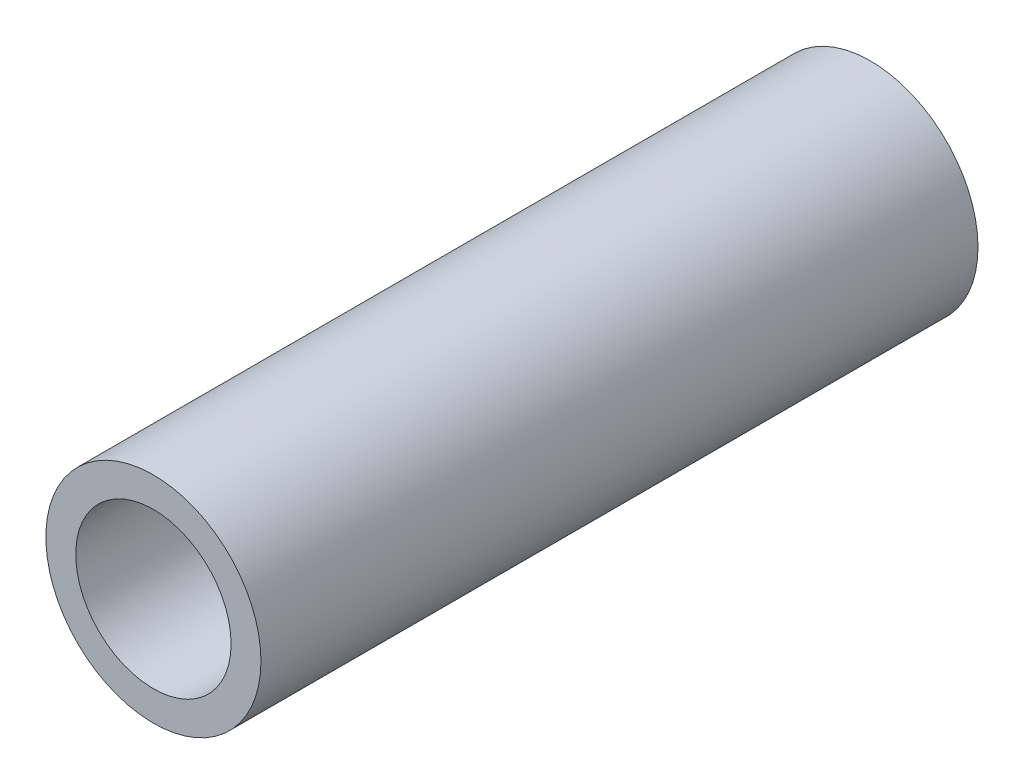
ISO-10303-21;
HEADER;
FILE_DESCRIPTION(('STEP AP214'),'2;1');
FILE_NAME('part.step','',(''),(''),'','','');
FILE_SCHEMA(('AUTOMOTIVE_DESIGN { 1 0 10303 214 1 1 1 1 }'));
ENDSEC;
DATA;
#1=APPLICATION_CONTEXT('core data for automotive mechanical design processes');
#2=APPLICATION_PROTOCOL_DEFINITION('international standard','automotive_design',2000,#1);
#3=PRODUCT_CONTEXT('',#1,'mechanical');
#4=PRODUCT('Part','Part','',(#3));
#5=PRODUCT_RELATED_PRODUCT_CATEGORY('part','',(#4));
#6=PRODUCT_DEFINITION_FORMATION('','',#4);
#7=PRODUCT_DEFINITION_CONTEXT('part definition',#1,'design');
#8=PRODUCT_DEFINITION('design','',#6,#7);
#9=PRODUCT_DEFINITION_SHAPE('','',#8);
#10=(LENGTH_UNIT() NAMED_UNIT(*) SI_UNIT(.MILLI.,.METRE.));
#11=(NAMED_UNIT(*) PLANE_ANGLE_UNIT() SI_UNIT($,.RADIAN.));
#12=(NAMED_UNIT(*) SI_UNIT($,.STERADIAN.) SOLID_ANGLE_UNIT());
#13=UNCERTAINTY_MEASURE_WITH_UNIT(LENGTH_MEASURE(1.E-05),#10,'distance_accuracy_value','');
#14=(GEOMETRIC_REPRESENTATION_CONTEXT(3) GLOBAL_UNCERTAINTY_ASSIGNED_CONTEXT((#13)) GLOBAL_UNIT_ASSIGNED_CONTEXT((#10,
#11,#12)) REPRESENTATION_CONTEXT('',''));
#15=CARTESIAN_POINT('',(0.,0.,0.));
#16=DIRECTION('',(0.,0.,1.));
#17=DIRECTION('',(1.,0.,0.));
#18=AXIS2_PLACEMENT_3D('',#15,#16,#17);
#19=CARTESIAN_POINT('',(0.,0.,-30.));
#20=DIRECTION('',(0.,0.,1.));
#21=DIRECTION('',(1.,0.,0.));
#22=AXIS2_PLACEMENT_3D('',#19,#20,#21);
#23=CYLINDRICAL_SURFACE('',#22,9.);
#24=CARTESIAN_POINT('',(0.,0.,-30.));
#25=DIRECTION('',(0.,0.,1.));
#26=DIRECTION('',(1.,0.,0.));
#27=AXIS2_PLACEMENT_3D('',#24,#25,#26);
#28=CIRCLE('',#27,9.);
#29=CARTESIAN_POINT('',(9.,0.,-30.));
#30=VERTEX_POINT('',#29);
#31=EDGE_CURVE('E10',#30,#30,#28,.T.);
#32=ORIENTED_EDGE('',*,*,#31,.T.);
#33=EDGE_LOOP('',(#32));
#34=FACE_BOUND('',#33,.T.);
#35=CARTESIAN_POINT('',(0.,0.,30.));
#36=DIRECTION('',(0.,0.,1.));
#37=DIRECTION('',(1.,0.,0.));
#38=AXIS2_PLACEMENT_3D('',#35,#36,#37);
#39=CIRCLE('',#38,9.);
#40=CARTESIAN_POINT('',(9.,0.,30.));
#41=VERTEX_POINT('',#40);
#42=EDGE_CURVE('E45',#41,#41,#39,.T.);
#43=ORIENTED_EDGE('',*,*,#42,.F.);
#44=EDGE_LOOP('',(#43));
#45=FACE_BOUND('',#44,.T.);
#46=ADVANCED_FACE('F35',(#34,#45),#23,.T.);
#47=CARTESIAN_POINT('',(0.,0.,-30.));
#48=DIRECTION('',(0.,0.,1.));
#49=DIRECTION('',(1.,0.,0.));
#50=AXIS2_PLACEMENT_3D('',#47,#48,#49);
#51=PLANE('',#50);
#52=CARTESIAN_POINT('',(0.,0.,-30.));
#53=DIRECTION('',(0.,0.,1.));
#54=DIRECTION('',(1.,0.,0.));
#55=AXIS2_PLACEMENT_3D('',#52,#53,#54);
#56=CIRCLE('',#55,6.5);
#57=CARTESIAN_POINT('',(6.5,0.,-30.));
#58=VERTEX_POINT('',#57);
#59=EDGE_CURVE('E41',#58,#58,#56,.T.);
#60=ORIENTED_EDGE('',*,*,#59,.T.);
#61=EDGE_LOOP('',(#60));
#62=FACE_BOUND('',#61,.T.);
#63=ORIENTED_EDGE('',*,*,#31,.F.);
#64=EDGE_LOOP('',(#63));
#65=FACE_BOUND('',#64,.T.);
#66=ADVANCED_FACE('F64',(#62,#65),#51,.F.);
#67=CARTESIAN_POINT('',(0.,0.,-30.));
#68=DIRECTION('',(0.,0.,1.));
#69=DIRECTION('',(1.,0.,0.));
#70=AXIS2_PLACEMENT_3D('',#67,#68,#69);
#71=CYLINDRICAL_SURFACE('',#70,6.5);
#72=ORIENTED_EDGE('',*,*,#59,.F.);
#73=EDGE_LOOP('',(#72));
#74=FACE_BOUND('',#73,.T.);
#75=CARTESIAN_POINT('',(0.,0.,30.));
#76=DIRECTION('',(0.,0.,1.));
#77=DIRECTION('',(1.,0.,0.));
#78=AXIS2_PLACEMENT_3D('',#75,#76,#77);
#79=CIRCLE('',#78,6.5);
#80=CARTESIAN_POINT('',(6.5,0.,30.));
#81=VERTEX_POINT('',#80);
#82=EDGE_CURVE('E49',#81,#81,#79,.T.);
#83=ORIENTED_EDGE('',*,*,#82,.T.);
#84=EDGE_LOOP('',(#83));
#85=FACE_BOUND('',#84,.T.);
#86=ADVANCED_FACE('F55',(#74,#85),#71,.F.);
#87=CARTESIAN_POINT('',(0.,0.,30.));
#88=DIRECTION('',(0.,0.,1.));
#89=DIRECTION('',(1.,0.,0.));
#90=AXIS2_PLACEMENT_3D('',#87,#88,#89);
#91=PLANE('',#90);
#92=ORIENTED_EDGE('',*,*,#42,.T.);
#93=EDGE_LOOP('',(#92));
#94=FACE_BOUND('',#93,.T.);
#95=ORIENTED_EDGE('',*,*,#82,.F.);
#96=EDGE_LOOP('',(#95));
#97=FACE_BOUND('',#96,.T.);
#98=ADVANCED_FACE('F57',(#94,#97),#91,.T.);
#99=CLOSED_SHELL('',(#46,#66,#86,#98));
#100=MANIFOLD_SOLID_BREP('B2',#99);
#101=ADVANCED_BREP_SHAPE_REPRESENTATION('',(#18,#100),#14);
#102=SHAPE_DEFINITION_REPRESENTATION(#9,#101);
ENDSEC;
END-ISO-10303-21;
